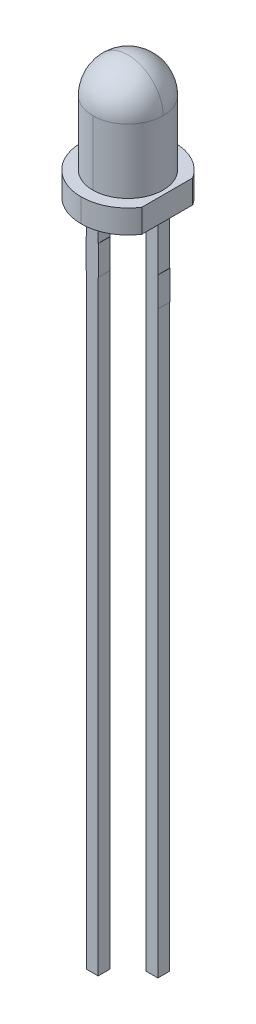
ISO-10303-21;
HEADER;
FILE_DESCRIPTION(('STEP AP214'),'2;1');
FILE_NAME('part.step','',(''),(''),'','','');
FILE_SCHEMA(('AUTOMOTIVE_DESIGN { 1 0 10303 214 1 1 1 1 }'));
ENDSEC;
DATA;
#1=APPLICATION_CONTEXT('core data for automotive mechanical design processes');
#2=APPLICATION_PROTOCOL_DEFINITION('international standard','automotive_design',2000,#1);
#3=PRODUCT_CONTEXT('',#1,'mechanical');
#4=PRODUCT('Part','Part','',(#3));
#5=PRODUCT_RELATED_PRODUCT_CATEGORY('part','',(#4));
#6=PRODUCT_DEFINITION_FORMATION('','',#4);
#7=PRODUCT_DEFINITION_CONTEXT('part definition',#1,'design');
#8=PRODUCT_DEFINITION('design','',#6,#7);
#9=PRODUCT_DEFINITION_SHAPE('','',#8);
#10=(LENGTH_UNIT() NAMED_UNIT(*) SI_UNIT(.MILLI.,.METRE.));
#11=(NAMED_UNIT(*) PLANE_ANGLE_UNIT() SI_UNIT($,.RADIAN.));
#12=(NAMED_UNIT(*) SI_UNIT($,.STERADIAN.) SOLID_ANGLE_UNIT());
#13=UNCERTAINTY_MEASURE_WITH_UNIT(LENGTH_MEASURE(1.E-05),#10,'distance_accuracy_value','');
#14=(GEOMETRIC_REPRESENTATION_CONTEXT(3) GLOBAL_UNCERTAINTY_ASSIGNED_CONTEXT((#13)) GLOBAL_UNIT_ASSIGNED_CONTEXT((#10,
#11,#12)) REPRESENTATION_CONTEXT('',''));
#15=CARTESIAN_POINT('',(0.,0.,0.));
#16=DIRECTION('',(0.,0.,1.));
#17=DIRECTION('',(1.,0.,0.));
#18=AXIS2_PLACEMENT_3D('',#15,#16,#17);
#19=CARTESIAN_POINT('',(1.68,2.53,1.18557375835093));
#20=DIRECTION('',(-1.,0.,0.));
#21=DIRECTION('',(0.,0.,1.));
#22=AXIS2_PLACEMENT_3D('',#19,#20,#21);
#23=PLANE('',#22);
#24=DIRECTION('',(0.,0.,1.));
#25=VECTOR('',#24,1.);
#26=CARTESIAN_POINT('',(1.68,1.,0.));
#27=LINE('',#26,#25);
#28=CARTESIAN_POINT('',(1.68,1.,-1.08517279730004));
#29=VERTEX_POINT('',#28);
#30=CARTESIAN_POINT('',(1.68,1.,1.08517279730004));
#31=VERTEX_POINT('',#30);
#32=EDGE_CURVE('P0_E50',#29,#31,#27,.T.);
#33=ORIENTED_EDGE('',*,*,#32,.T.);
#34=DIRECTION('',(0.,1.,0.));
#35=VECTOR('',#34,1.);
#36=CARTESIAN_POINT('',(1.68,1.,1.08517279730004));
#37=LINE('',#36,#35);
#38=CARTESIAN_POINT('',(1.68,0.,1.08517279730004));
#39=VERTEX_POINT('',#38);
#40=EDGE_CURVE('P0_E115',#39,#31,#37,.T.);
#41=ORIENTED_EDGE('',*,*,#40,.F.);
#42=DIRECTION('',(0.,0.,1.));
#43=VECTOR('',#42,1.);
#44=CARTESIAN_POINT('',(1.68,0.,0.));
#45=LINE('',#44,#43);
#46=CARTESIAN_POINT('',(1.68,0.,-1.08517279730004));
#47=VERTEX_POINT('',#46);
#48=EDGE_CURVE('P0_E24',#47,#39,#45,.T.);
#49=ORIENTED_EDGE('',*,*,#48,.F.);
#50=DIRECTION('',(0.,-1.,0.));
#51=VECTOR('',#50,1.);
#52=CARTESIAN_POINT('',(1.68,1.,-1.08517279730004));
#53=LINE('',#52,#51);
#54=EDGE_CURVE('P0_E132',#29,#47,#53,.T.);
#55=ORIENTED_EDGE('',*,*,#54,.F.);
#56=EDGE_LOOP('',(#33,#41,#49,#55));
#57=FACE_BOUND('',#56,.T.);
#58=ADVANCED_FACE('P0_F16',(#57),#23,.F.);
#59=CARTESIAN_POINT('',(0.,0.,0.));
#60=DIRECTION('',(0.,-1.,0.));
#61=DIRECTION('',(0.,0.,-1.));
#62=AXIS2_PLACEMENT_3D('',#59,#60,#61);
#63=CYLINDRICAL_SURFACE('',#62,1.5);
#64=DIRECTION('',(0.,-1.,0.));
#65=VECTOR('',#64,1.);
#66=CARTESIAN_POINT('',(0.,0.,1.5));
#67=LINE('',#66,#65);
#68=CARTESIAN_POINT('',(0.,3.75,1.5));
#69=VERTEX_POINT('',#68);
#70=CARTESIAN_POINT('',(0.,1.,1.5));
#71=VERTEX_POINT('',#70);
#72=EDGE_CURVE('P0_E159',#69,#71,#67,.T.);
#73=ORIENTED_EDGE('',*,*,#72,.F.);
#74=CARTESIAN_POINT('',(0.,3.75,0.));
#75=DIRECTION('',(0.,-1.,0.));
#76=DIRECTION('',(0.,0.,-1.));
#77=AXIS2_PLACEMENT_3D('',#74,#75,#76);
#78=CIRCLE('',#77,1.5);
#79=CARTESIAN_POINT('',(-1.5,3.75,0.));
#80=VERTEX_POINT('',#79);
#81=EDGE_CURVE('P0_E10',#69,#80,#78,.T.);
#82=ORIENTED_EDGE('',*,*,#81,.T.);
#83=CARTESIAN_POINT('',(0.,3.75,0.));
#84=DIRECTION('',(0.,-1.,0.));
#85=DIRECTION('',(0.,0.,-1.));
#86=AXIS2_PLACEMENT_3D('',#83,#84,#85);
#87=CIRCLE('',#86,1.5);
#88=CARTESIAN_POINT('',(0.,3.75,-1.5));
#89=VERTEX_POINT('',#88);
#90=EDGE_CURVE('P0_E125',#80,#89,#87,.T.);
#91=ORIENTED_EDGE('',*,*,#90,.T.);
#92=DIRECTION('',(0.,-1.,0.));
#93=VECTOR('',#92,1.);
#94=CARTESIAN_POINT('',(0.,0.,-1.5));
#95=LINE('',#94,#93);
#96=CARTESIAN_POINT('',(0.,1.,-1.5));
#97=VERTEX_POINT('',#96);
#98=EDGE_CURVE('P0_E168',#89,#97,#95,.T.);
#99=ORIENTED_EDGE('',*,*,#98,.T.);
#100=CARTESIAN_POINT('',(0.,1.,0.));
#101=DIRECTION('',(0.,-1.,0.));
#102=DIRECTION('',(0.,0.,-1.));
#103=AXIS2_PLACEMENT_3D('',#100,#101,#102);
#104=CIRCLE('',#103,1.5);
#105=EDGE_CURVE('P0_E143',#71,#97,#104,.T.);
#106=ORIENTED_EDGE('',*,*,#105,.F.);
#107=EDGE_LOOP('',(#73,#82,#91,#99,#106));
#108=FACE_BOUND('',#107,.T.);
#109=ADVANCED_FACE('P0_F195',(#108),#63,.T.);
#110=CARTESIAN_POINT('',(0.,3.75,0.));
#111=DIRECTION('',(0.,0.,-1.));
#112=DIRECTION('',(-1.,0.,0.));
#113=AXIS2_PLACEMENT_3D('',#110,#111,#112);
#114=SPHERICAL_SURFACE('',#113,1.5);
#115=CARTESIAN_POINT('',(0.,3.75,0.));
#116=DIRECTION('',(0.,0.,-1.));
#117=DIRECTION('',(-1.,0.,0.));
#118=AXIS2_PLACEMENT_3D('',#115,#116,#117);
#119=CIRCLE('',#118,1.5);
#120=CARTESIAN_POINT('',(0.,5.25,0.));
#121=VERTEX_POINT('',#120);
#122=CARTESIAN_POINT('',(1.5,3.75,0.));
#123=VERTEX_POINT('',#122);
#124=EDGE_CURVE('P0_E179',#121,#123,#119,.T.);
#125=ORIENTED_EDGE('',*,*,#124,.F.);
#126=CARTESIAN_POINT('',(0.,3.75,0.));
#127=DIRECTION('',(0.,0.,1.));
#128=DIRECTION('',(1.,0.,0.));
#129=AXIS2_PLACEMENT_3D('',#126,#127,#128);
#130=CIRCLE('',#129,1.5);
#131=EDGE_CURVE('P0_E175',#121,#80,#130,.T.);
#132=ORIENTED_EDGE('',*,*,#131,.T.);
#133=ORIENTED_EDGE('',*,*,#81,.F.);
#134=CARTESIAN_POINT('',(0.,3.75,0.));
#135=DIRECTION('',(0.,-1.,0.));
#136=DIRECTION('',(0.,0.,-1.));
#137=AXIS2_PLACEMENT_3D('',#134,#135,#136);
#138=CIRCLE('',#137,1.5);
#139=EDGE_CURVE('P0_E155',#123,#69,#138,.T.);
#140=ORIENTED_EDGE('',*,*,#139,.F.);
#141=EDGE_LOOP('',(#125,#132,#133,#140));
#142=FACE_BOUND('',#141,.T.);
#143=ADVANCED_FACE('P0_F214',(#142),#114,.T.);
#144=CARTESIAN_POINT('',(0.,0.,0.));
#145=DIRECTION('',(0.,1.,0.));
#146=DIRECTION('',(1.,0.,0.));
#147=AXIS2_PLACEMENT_3D('',#144,#145,#146);
#148=PLANE('',#147);
#149=CARTESIAN_POINT('',(0.,0.,0.));
#150=DIRECTION('',(0.,1.,0.));
#151=DIRECTION('',(0.,0.,1.));
#152=AXIS2_PLACEMENT_3D('',#149,#150,#151);
#153=CIRCLE('',#152,2.);
#154=CARTESIAN_POINT('',(0.,0.,-2.));
#155=VERTEX_POINT('',#154);
#156=EDGE_CURVE('P0_E139',#47,#155,#153,.T.);
#157=ORIENTED_EDGE('',*,*,#156,.F.);
#158=ORIENTED_EDGE('',*,*,#48,.T.);
#159=CARTESIAN_POINT('',(0.,0.,0.));
#160=DIRECTION('',(0.,1.,0.));
#161=DIRECTION('',(0.,0.,1.));
#162=AXIS2_PLACEMENT_3D('',#159,#160,#161);
#163=CIRCLE('',#162,2.);
#164=CARTESIAN_POINT('',(0.,0.,2.));
#165=VERTEX_POINT('',#164);
#166=EDGE_CURVE('P0_E110',#165,#39,#163,.T.);
#167=ORIENTED_EDGE('',*,*,#166,.F.);
#168=CARTESIAN_POINT('',(0.,0.,0.));
#169=DIRECTION('',(0.,1.,0.));
#170=DIRECTION('',(0.,0.,1.));
#171=AXIS2_PLACEMENT_3D('',#168,#169,#170);
#172=CIRCLE('',#171,2.);
#173=EDGE_CURVE('P0_E96',#155,#165,#172,.T.);
#174=ORIENTED_EDGE('',*,*,#173,.F.);
#175=EDGE_LOOP('',(#157,#158,#167,#174));
#176=FACE_BOUND('',#175,.T.);
#177=ADVANCED_FACE('P0_F111',(#176),#148,.F.);
#178=CARTESIAN_POINT('',(0.,1.,0.));
#179=DIRECTION('',(0.,1.,0.));
#180=DIRECTION('',(1.,0.,0.));
#181=AXIS2_PLACEMENT_3D('',#178,#179,#180);
#182=PLANE('',#181);
#183=CARTESIAN_POINT('',(0.,1.,0.));
#184=DIRECTION('',(0.,-1.,0.));
#185=DIRECTION('',(0.,0.,-1.));
#186=AXIS2_PLACEMENT_3D('',#183,#184,#185);
#187=CIRCLE('',#186,1.5);
#188=EDGE_CURVE('P0_E163',#97,#71,#187,.T.);
#189=ORIENTED_EDGE('',*,*,#188,.T.);
#190=ORIENTED_EDGE('',*,*,#105,.T.);
#191=EDGE_LOOP('',(#189,#190));
#192=FACE_BOUND('',#191,.T.);
#193=ORIENTED_EDGE('',*,*,#32,.F.);
#194=CARTESIAN_POINT('',(0.,1.,0.));
#195=DIRECTION('',(0.,1.,0.));
#196=DIRECTION('',(0.,0.,1.));
#197=AXIS2_PLACEMENT_3D('',#194,#195,#196);
#198=CIRCLE('',#197,2.);
#199=CARTESIAN_POINT('',(0.,1.,-2.));
#200=VERTEX_POINT('',#199);
#201=EDGE_CURVE('P0_E107',#29,#200,#198,.T.);
#202=ORIENTED_EDGE('',*,*,#201,.T.);
#203=CARTESIAN_POINT('',(0.,1.,0.));
#204=DIRECTION('',(0.,1.,0.));
#205=DIRECTION('',(0.,0.,1.));
#206=AXIS2_PLACEMENT_3D('',#203,#204,#205);
#207=CIRCLE('',#206,2.);
#208=CARTESIAN_POINT('',(0.,1.,2.));
#209=VERTEX_POINT('',#208);
#210=EDGE_CURVE('P0_E134',#200,#209,#207,.T.);
#211=ORIENTED_EDGE('',*,*,#210,.T.);
#212=CARTESIAN_POINT('',(0.,1.,0.));
#213=DIRECTION('',(0.,1.,0.));
#214=DIRECTION('',(0.,0.,1.));
#215=AXIS2_PLACEMENT_3D('',#212,#213,#214);
#216=CIRCLE('',#215,2.);
#217=EDGE_CURVE('P0_E118',#209,#31,#216,.T.);
#218=ORIENTED_EDGE('',*,*,#217,.T.);
#219=EDGE_LOOP('',(#193,#202,#211,#218));
#220=FACE_BOUND('',#219,.T.);
#221=ADVANCED_FACE('P0_F203',(#192,#220),#182,.T.);
#222=CARTESIAN_POINT('',(0.,1.,0.));
#223=DIRECTION('',(0.,-1.,0.));
#224=DIRECTION('',(0.,0.,-1.));
#225=AXIS2_PLACEMENT_3D('',#222,#223,#224);
#226=CYLINDRICAL_SURFACE('',#225,2.);
#227=DIRECTION('',(0.,-1.,0.));
#228=VECTOR('',#227,1.);
#229=CARTESIAN_POINT('',(0.,1.,-2.));
#230=LINE('',#229,#228);
#231=EDGE_CURVE('P0_E104',#200,#155,#230,.T.);
#232=ORIENTED_EDGE('',*,*,#231,.F.);
#233=ORIENTED_EDGE('',*,*,#201,.F.);
#234=ORIENTED_EDGE('',*,*,#54,.T.);
#235=ORIENTED_EDGE('',*,*,#156,.T.);
#236=EDGE_LOOP('',(#232,#233,#234,#235));
#237=FACE_BOUND('',#236,.T.);
#238=ADVANCED_FACE('P0_F205',(#237),#226,.T.);
#239=CARTESIAN_POINT('',(0.,1.,0.));
#240=DIRECTION('',(0.,-1.,0.));
#241=DIRECTION('',(0.,0.,-1.));
#242=AXIS2_PLACEMENT_3D('',#239,#240,#241);
#243=CYLINDRICAL_SURFACE('',#242,2.);
#244=DIRECTION('',(0.,-1.,0.));
#245=VECTOR('',#244,1.);
#246=CARTESIAN_POINT('',(0.,1.,2.));
#247=LINE('',#246,#245);
#248=EDGE_CURVE('P0_E101',#209,#165,#247,.T.);
#249=ORIENTED_EDGE('',*,*,#248,.F.);
#250=ORIENTED_EDGE('',*,*,#210,.F.);
#251=ORIENTED_EDGE('',*,*,#231,.T.);
#252=ORIENTED_EDGE('',*,*,#173,.T.);
#253=EDGE_LOOP('',(#249,#250,#251,#252));
#254=FACE_BOUND('',#253,.T.);
#255=ADVANCED_FACE('P0_F98',(#254),#243,.T.);
#256=CARTESIAN_POINT('',(0.,1.,0.));
#257=DIRECTION('',(0.,-1.,0.));
#258=DIRECTION('',(0.,0.,-1.));
#259=AXIS2_PLACEMENT_3D('',#256,#257,#258);
#260=CYLINDRICAL_SURFACE('',#259,2.);
#261=ORIENTED_EDGE('',*,*,#217,.F.);
#262=ORIENTED_EDGE('',*,*,#248,.T.);
#263=ORIENTED_EDGE('',*,*,#166,.T.);
#264=ORIENTED_EDGE('',*,*,#40,.T.);
#265=EDGE_LOOP('',(#261,#262,#263,#264));
#266=FACE_BOUND('',#265,.T.);
#267=ADVANCED_FACE('P0_F117',(#266),#260,.T.);
#268=CARTESIAN_POINT('',(0.,3.75,0.));
#269=DIRECTION('',(0.,0.,-1.));
#270=DIRECTION('',(-1.,0.,0.));
#271=AXIS2_PLACEMENT_3D('',#268,#269,#270);
#272=SPHERICAL_SURFACE('',#271,1.5);
#273=ORIENTED_EDGE('',*,*,#131,.F.);
#274=ORIENTED_EDGE('',*,*,#124,.T.);
#275=CARTESIAN_POINT('',(0.,3.75,0.));
#276=DIRECTION('',(0.,-1.,0.));
#277=DIRECTION('',(0.,0.,-1.));
#278=AXIS2_PLACEMENT_3D('',#275,#276,#277);
#279=CIRCLE('',#278,1.5);
#280=EDGE_CURVE('P0_E171',#89,#123,#279,.T.);
#281=ORIENTED_EDGE('',*,*,#280,.F.);
#282=ORIENTED_EDGE('',*,*,#90,.F.);
#283=EDGE_LOOP('',(#273,#274,#281,#282));
#284=FACE_BOUND('',#283,.T.);
#285=ADVANCED_FACE('P0_F199',(#284),#272,.T.);
#286=CARTESIAN_POINT('',(0.,0.,0.));
#287=DIRECTION('',(0.,-1.,0.));
#288=DIRECTION('',(0.,0.,-1.));
#289=AXIS2_PLACEMENT_3D('',#286,#287,#288);
#290=CYLINDRICAL_SURFACE('',#289,1.5);
#291=ORIENTED_EDGE('',*,*,#139,.T.);
#292=ORIENTED_EDGE('',*,*,#72,.T.);
#293=ORIENTED_EDGE('',*,*,#188,.F.);
#294=ORIENTED_EDGE('',*,*,#98,.F.);
#295=ORIENTED_EDGE('',*,*,#280,.T.);
#296=EDGE_LOOP('',(#291,#292,#293,#294,#295));
#297=FACE_BOUND('',#296,.T.);
#298=ADVANCED_FACE('P0_F202',(#297),#290,.T.);
#299=CLOSED_SHELL('',(#58,#109,#143,#177,#221,#238,#255,#267,#285,#298));
#300=MANIFOLD_SOLID_BREP('P0_B1',#299);
#301=CARTESIAN_POINT('',(-1.015,-3.3590830423855,-1.60384641730942));
#302=DIRECTION('',(1.,0.,0.));
#303=DIRECTION('',(0.,1.,0.));
#304=AXIS2_PLACEMENT_3D('',#301,#302,#303);
#305=PLANE('',#304);
#306=DIRECTION('',(0.,-1.,0.));
#307=VECTOR('',#306,1.);
#308=CARTESIAN_POINT('',(-1.015,-3.3590830423855,-0.250000008));
#309=LINE('',#308,#307);
#310=CARTESIAN_POINT('',(-1.015,-2.1090830023855,-0.250000008));
#311=VERTEX_POINT('',#310);
#312=CARTESIAN_POINT('',(-1.015,-3.3590830423855,-0.250000008));
#313=VERTEX_POINT('',#312);
#314=EDGE_CURVE('P1_E189',#311,#313,#309,.T.);
#315=ORIENTED_EDGE('',*,*,#314,.F.);
#316=DIRECTION('',(0.,0.,1.));
#317=VECTOR('',#316,1.);
#318=CARTESIAN_POINT('',(-1.015,-2.1090830023855,-1.60384641730942));
#319=LINE('',#318,#317);
#320=CARTESIAN_POINT('',(-1.015,-2.1090830023855,0.250000008));
#321=VERTEX_POINT('',#320);
#322=EDGE_CURVE('P1_E11',#311,#321,#319,.T.);
#323=ORIENTED_EDGE('',*,*,#322,.T.);
#324=DIRECTION('',(0.,1.,0.));
#325=VECTOR('',#324,1.);
#326=CARTESIAN_POINT('',(-1.015,-3.3590830423855,0.250000008));
#327=LINE('',#326,#325);
#328=CARTESIAN_POINT('',(-1.015,-3.3590830423855,0.250000008));
#329=VERTEX_POINT('',#328);
#330=EDGE_CURVE('P1_E195',#329,#321,#327,.T.);
#331=ORIENTED_EDGE('',*,*,#330,.F.);
#332=DIRECTION('',(0.,0.,1.));
#333=VECTOR('',#332,1.);
#334=CARTESIAN_POINT('',(-1.015,-3.3590830423855,-1.60384641730942));
#335=LINE('',#334,#333);
#336=EDGE_CURVE('P1_E20',#313,#329,#335,.T.);
#337=ORIENTED_EDGE('',*,*,#336,.F.);
#338=EDGE_LOOP('',(#315,#323,#331,#337));
#339=FACE_BOUND('',#338,.T.);
#340=ADVANCED_FACE('P1_F17',(#339),#305,.T.);
#341=CARTESIAN_POINT('',(-1.535,-2.1090830023855,-1.60384641730942));
#342=DIRECTION('',(0.,1.,0.));
#343=DIRECTION('',(1.,0.,0.));
#344=AXIS2_PLACEMENT_3D('',#341,#342,#343);
#345=PLANE('',#344);
#346=DIRECTION('',(0.,0.,-1.));
#347=VECTOR('',#346,1.);
#348=CARTESIAN_POINT('',(-1.025,-2.10908300238549,0.));
#349=LINE('',#348,#347);
#350=CARTESIAN_POINT('',(-1.025,-2.10908300238549,0.250000008));
#351=VERTEX_POINT('',#350);
#352=CARTESIAN_POINT('',(-1.025,-2.1090830023855,-0.250000008));
#353=VERTEX_POINT('',#352);
#354=EDGE_CURVE('P1_E238',#351,#353,#349,.T.);
#355=ORIENTED_EDGE('',*,*,#354,.F.);
#356=DIRECTION('',(-1.,0.,0.));
#357=VECTOR('',#356,1.);
#358=CARTESIAN_POINT('',(-1.535,-2.1090830023855,0.250000008));
#359=LINE('',#358,#357);
#360=EDGE_CURVE('P1_E193',#321,#351,#359,.T.);
#361=ORIENTED_EDGE('',*,*,#360,.F.);
#362=ORIENTED_EDGE('',*,*,#322,.F.);
#363=DIRECTION('',(1.,0.,0.));
#364=VECTOR('',#363,1.);
#365=CARTESIAN_POINT('',(-1.535,-2.1090830023855,-0.250000008));
#366=LINE('',#365,#364);
#367=EDGE_CURVE('P1_E192',#353,#311,#366,.T.);
#368=ORIENTED_EDGE('',*,*,#367,.F.);
#369=EDGE_LOOP('',(#355,#361,#362,#368));
#370=FACE_BOUND('',#369,.T.);
#371=ADVANCED_FACE('P1_F298',(#370),#345,.T.);
#372=CARTESIAN_POINT('',(-1.535,-3.3590830423855,-1.60384641730942));
#373=DIRECTION('',(0.,-1.,0.));
#374=DIRECTION('',(0.,0.,-1.));
#375=AXIS2_PLACEMENT_3D('',#372,#373,#374);
#376=PLANE('',#375);
#377=DIRECTION('',(0.,0.,1.));
#378=VECTOR('',#377,1.);
#379=CARTESIAN_POINT('',(-1.025,-3.3590830423855,0.));
#380=LINE('',#379,#378);
#381=CARTESIAN_POINT('',(-1.025,-3.3590830423855,-0.250000008));
#382=VERTEX_POINT('',#381);
#383=CARTESIAN_POINT('',(-1.025,-3.3590830423855,0.250000008));
#384=VERTEX_POINT('',#383);
#385=EDGE_CURVE('P1_E167',#382,#384,#380,.T.);
#386=ORIENTED_EDGE('',*,*,#385,.F.);
#387=DIRECTION('',(-1.,0.,0.));
#388=VECTOR('',#387,1.);
#389=CARTESIAN_POINT('',(-1.535,-3.3590830423855,-0.250000008));
#390=LINE('',#389,#388);
#391=EDGE_CURVE('P1_E150',#313,#382,#390,.T.);
#392=ORIENTED_EDGE('',*,*,#391,.F.);
#393=ORIENTED_EDGE('',*,*,#336,.T.);
#394=DIRECTION('',(1.,0.,0.));
#395=VECTOR('',#394,1.);
#396=CARTESIAN_POINT('',(-1.535,-3.3590830423855,0.250000008));
#397=LINE('',#396,#395);
#398=EDGE_CURVE('P1_E256',#384,#329,#397,.T.);
#399=ORIENTED_EDGE('',*,*,#398,.F.);
#400=EDGE_LOOP('',(#386,#392,#393,#399));
#401=FACE_BOUND('',#400,.T.);
#402=ADVANCED_FACE('P1_F312',(#401),#376,.T.);
#403=CARTESIAN_POINT('',(-1.535,-3.3590830423855,-1.60384641730942));
#404=DIRECTION('',(0.,-1.,0.));
#405=DIRECTION('',(0.,0.,-1.));
#406=AXIS2_PLACEMENT_3D('',#403,#404,#405);
#407=PLANE('',#406);
#408=DIRECTION('',(-1.,0.,0.));
#409=VECTOR('',#408,1.);
#410=CARTESIAN_POINT('',(-1.535,-3.3590830423855,-0.250000008));
#411=LINE('',#410,#409);
#412=CARTESIAN_POINT('',(-1.525,-3.3590830423855,-0.250000008));
#413=VERTEX_POINT('',#412);
#414=CARTESIAN_POINT('',(-1.535,-3.3590830423855,-0.250000008));
#415=VERTEX_POINT('',#414);
#416=EDGE_CURVE('P1_E149',#413,#415,#411,.T.);
#417=ORIENTED_EDGE('',*,*,#416,.F.);
#418=DIRECTION('',(0.,0.,1.));
#419=VECTOR('',#418,1.);
#420=CARTESIAN_POINT('',(-1.525,-3.3590830423855,0.));
#421=LINE('',#420,#419);
#422=CARTESIAN_POINT('',(-1.525,-3.3590830423855,0.250000008));
#423=VERTEX_POINT('',#422);
#424=EDGE_CURVE('P1_E160',#413,#423,#421,.T.);
#425=ORIENTED_EDGE('',*,*,#424,.T.);
#426=DIRECTION('',(1.,0.,0.));
#427=VECTOR('',#426,1.);
#428=CARTESIAN_POINT('',(-1.535,-3.3590830423855,0.250000008));
#429=LINE('',#428,#427);
#430=CARTESIAN_POINT('',(-1.535,-3.3590830423855,0.250000008));
#431=VERTEX_POINT('',#430);
#432=EDGE_CURVE('P1_E197',#431,#423,#429,.T.);
#433=ORIENTED_EDGE('',*,*,#432,.F.);
#434=DIRECTION('',(0.,0.,1.));
#435=VECTOR('',#434,1.);
#436=CARTESIAN_POINT('',(-1.535,-3.3590830423855,-1.60384641730942));
#437=LINE('',#436,#435);
#438=EDGE_CURVE('P1_E268',#415,#431,#437,.T.);
#439=ORIENTED_EDGE('',*,*,#438,.F.);
#440=EDGE_LOOP('',(#417,#425,#433,#439));
#441=FACE_BOUND('',#440,.T.);
#442=ADVANCED_FACE('P1_F316',(#441),#407,.T.);
#443=CARTESIAN_POINT('',(-1.535,-2.1090830023855,-1.60384641730942));
#444=DIRECTION('',(0.,1.,0.));
#445=DIRECTION('',(1.,0.,0.));
#446=AXIS2_PLACEMENT_3D('',#443,#444,#445);
#447=PLANE('',#446);
#448=DIRECTION('',(-1.,0.,0.));
#449=VECTOR('',#448,1.);
#450=CARTESIAN_POINT('',(-1.535,-2.1090830023855,0.250000008));
#451=LINE('',#450,#449);
#452=CARTESIAN_POINT('',(-1.525,-2.1090830023855,0.250000008));
#453=VERTEX_POINT('',#452);
#454=CARTESIAN_POINT('',(-1.535,-2.1090830023855,0.250000008));
#455=VERTEX_POINT('',#454);
#456=EDGE_CURVE('P1_E249',#453,#455,#451,.T.);
#457=ORIENTED_EDGE('',*,*,#456,.F.);
#458=DIRECTION('',(0.,0.,-1.));
#459=VECTOR('',#458,1.);
#460=CARTESIAN_POINT('',(-1.525,-2.10908300238549,0.));
#461=LINE('',#460,#459);
#462=CARTESIAN_POINT('',(-1.525,-2.1090830023855,-0.250000008));
#463=VERTEX_POINT('',#462);
#464=EDGE_CURVE('P1_E184',#453,#463,#461,.T.);
#465=ORIENTED_EDGE('',*,*,#464,.T.);
#466=DIRECTION('',(1.,0.,0.));
#467=VECTOR('',#466,1.);
#468=CARTESIAN_POINT('',(-1.535,-2.1090830023855,-0.250000008));
#469=LINE('',#468,#467);
#470=CARTESIAN_POINT('',(-1.535,-2.1090830023855,-0.250000008));
#471=VERTEX_POINT('',#470);
#472=EDGE_CURVE('P1_E176',#471,#463,#469,.T.);
#473=ORIENTED_EDGE('',*,*,#472,.F.);
#474=DIRECTION('',(0.,0.,1.));
#475=VECTOR('',#474,1.);
#476=CARTESIAN_POINT('',(-1.535,-2.1090830023855,-1.60384641730942));
#477=LINE('',#476,#475);
#478=EDGE_CURVE('P1_E271',#471,#455,#477,.T.);
#479=ORIENTED_EDGE('',*,*,#478,.T.);
#480=EDGE_LOOP('',(#457,#465,#473,#479));
#481=FACE_BOUND('',#480,.T.);
#482=ADVANCED_FACE('P1_F307',(#481),#447,.T.);
#483=CARTESIAN_POINT('',(-1.535,-3.3590830423855,-1.60384641730942));
#484=DIRECTION('',(-1.,0.,0.));
#485=DIRECTION('',(0.,0.,1.));
#486=AXIS2_PLACEMENT_3D('',#483,#484,#485);
#487=PLANE('',#486);
#488=DIRECTION('',(0.,1.,0.));
#489=VECTOR('',#488,1.);
#490=CARTESIAN_POINT('',(-1.535,-3.3590830423855,-0.250000008));
#491=LINE('',#490,#489);
#492=EDGE_CURVE('P1_E180',#415,#471,#491,.T.);
#493=ORIENTED_EDGE('',*,*,#492,.F.);
#494=ORIENTED_EDGE('',*,*,#438,.T.);
#495=DIRECTION('',(0.,-1.,0.));
#496=VECTOR('',#495,1.);
#497=CARTESIAN_POINT('',(-1.535,-3.3590830423855,0.250000008));
#498=LINE('',#497,#496);
#499=EDGE_CURVE('P1_E201',#455,#431,#498,.T.);
#500=ORIENTED_EDGE('',*,*,#499,.F.);
#501=ORIENTED_EDGE('',*,*,#478,.F.);
#502=EDGE_LOOP('',(#493,#494,#500,#501));
#503=FACE_BOUND('',#502,.T.);
#504=ADVANCED_FACE('P1_F302',(#503),#487,.T.);
#505=CARTESIAN_POINT('',(0.,0.,0.));
#506=DIRECTION('',(0.,-1.,0.));
#507=DIRECTION('',(0.,0.,-1.));
#508=AXIS2_PLACEMENT_3D('',#505,#506,#507);
#509=PLANE('',#508);
#510=DIRECTION('',(-1.,0.,0.));
#511=VECTOR('',#510,1.);
#512=CARTESIAN_POINT('',(0.,0.,-0.250000008));
#513=LINE('',#512,#511);
#514=CARTESIAN_POINT('',(-1.025,0.,-0.250000008));
#515=VERTEX_POINT('',#514);
#516=CARTESIAN_POINT('',(-1.525,0.,-0.250000008));
#517=VERTEX_POINT('',#516);
#518=EDGE_CURVE('P1_E230',#515,#517,#513,.T.);
#519=ORIENTED_EDGE('',*,*,#518,.T.);
#520=DIRECTION('',(0.,0.,1.));
#521=VECTOR('',#520,1.);
#522=CARTESIAN_POINT('',(-1.525,0.,0.));
#523=LINE('',#522,#521);
#524=CARTESIAN_POINT('',(-1.525,0.,0.250000008));
#525=VERTEX_POINT('',#524);
#526=EDGE_CURVE('P1_E187',#517,#525,#523,.T.);
#527=ORIENTED_EDGE('',*,*,#526,.T.);
#528=DIRECTION('',(-1.,0.,0.));
#529=VECTOR('',#528,1.);
#530=CARTESIAN_POINT('',(0.,0.,0.250000008));
#531=LINE('',#530,#529);
#532=CARTESIAN_POINT('',(-1.025,0.,0.250000008));
#533=VERTEX_POINT('',#532);
#534=EDGE_CURVE('P1_E188',#533,#525,#531,.T.);
#535=ORIENTED_EDGE('',*,*,#534,.F.);
#536=DIRECTION('',(0.,0.,1.));
#537=VECTOR('',#536,1.);
#538=CARTESIAN_POINT('',(-1.025,0.,0.));
#539=LINE('',#538,#537);
#540=EDGE_CURVE('P1_E241',#515,#533,#539,.T.);
#541=ORIENTED_EDGE('',*,*,#540,.F.);
#542=EDGE_LOOP('',(#519,#527,#535,#541));
#543=FACE_BOUND('',#542,.T.);
#544=ADVANCED_FACE('P1_F306',(#543),#509,.F.);
#545=CARTESIAN_POINT('',(0.,-29.2,0.));
#546=DIRECTION('',(0.,-1.,0.));
#547=DIRECTION('',(0.,0.,-1.));
#548=AXIS2_PLACEMENT_3D('',#545,#546,#547);
#549=PLANE('',#548);
#550=DIRECTION('',(-1.,0.,0.));
#551=VECTOR('',#550,1.);
#552=CARTESIAN_POINT('',(0.,-29.2,-0.250000008));
#553=LINE('',#552,#551);
#554=CARTESIAN_POINT('',(-1.025,-29.2,-0.250000008));
#555=VERTEX_POINT('',#554);
#556=CARTESIAN_POINT('',(-1.525,-29.2,-0.250000008));
#557=VERTEX_POINT('',#556);
#558=EDGE_CURVE('P1_E137',#555,#557,#553,.T.);
#559=ORIENTED_EDGE('',*,*,#558,.F.);
#560=DIRECTION('',(0.,0.,1.));
#561=VECTOR('',#560,1.);
#562=CARTESIAN_POINT('',(-1.025,-29.2,0.));
#563=LINE('',#562,#561);
#564=CARTESIAN_POINT('',(-1.025,-29.2,0.250000008));
#565=VERTEX_POINT('',#564);
#566=EDGE_CURVE('P1_E140',#555,#565,#563,.T.);
#567=ORIENTED_EDGE('',*,*,#566,.T.);
#568=DIRECTION('',(-1.,0.,0.));
#569=VECTOR('',#568,1.);
#570=CARTESIAN_POINT('',(0.,-29.2,0.250000008));
#571=LINE('',#570,#569);
#572=CARTESIAN_POINT('',(-1.525,-29.2,0.250000008));
#573=VERTEX_POINT('',#572);
#574=EDGE_CURVE('P1_E200',#565,#573,#571,.T.);
#575=ORIENTED_EDGE('',*,*,#574,.T.);
#576=DIRECTION('',(0.,0.,1.));
#577=VECTOR('',#576,1.);
#578=CARTESIAN_POINT('',(-1.525,-29.2,0.));
#579=LINE('',#578,#577);
#580=EDGE_CURVE('P1_E143',#557,#573,#579,.T.);
#581=ORIENTED_EDGE('',*,*,#580,.F.);
#582=EDGE_LOOP('',(#559,#567,#575,#581));
#583=FACE_BOUND('',#582,.T.);
#584=ADVANCED_FACE('P1_F139',(#583),#549,.T.);
#585=CARTESIAN_POINT('',(-1.525,-29.2,0.));
#586=DIRECTION('',(-1.,0.,0.));
#587=DIRECTION('',(0.,0.,1.));
#588=AXIS2_PLACEMENT_3D('',#585,#586,#587);
#589=PLANE('',#588);
#590=ORIENTED_EDGE('',*,*,#464,.F.);
#591=DIRECTION('',(0.,1.,0.));
#592=VECTOR('',#591,1.);
#593=CARTESIAN_POINT('',(-1.525,-29.2,0.250000008));
#594=LINE('',#593,#592);
#595=EDGE_CURVE('P1_E245',#453,#525,#594,.T.);
#596=ORIENTED_EDGE('',*,*,#595,.T.);
#597=ORIENTED_EDGE('',*,*,#526,.F.);
#598=DIRECTION('',(0.,1.,0.));
#599=VECTOR('',#598,1.);
#600=CARTESIAN_POINT('',(-1.525,-29.2,-0.250000008));
#601=LINE('',#600,#599);
#602=EDGE_CURVE('P1_E179',#463,#517,#601,.T.);
#603=ORIENTED_EDGE('',*,*,#602,.F.);
#604=EDGE_LOOP('',(#590,#596,#597,#603));
#605=FACE_BOUND('',#604,.T.);
#606=ADVANCED_FACE('P1_F326',(#605),#589,.T.);
#607=CARTESIAN_POINT('',(0.,-29.2,0.250000008));
#608=DIRECTION('',(0.,0.,-1.));
#609=DIRECTION('',(0.,-1.,0.));
#610=AXIS2_PLACEMENT_3D('',#607,#608,#609);
#611=PLANE('',#610);
#612=ORIENTED_EDGE('',*,*,#595,.F.);
#613=ORIENTED_EDGE('',*,*,#456,.T.);
#614=ORIENTED_EDGE('',*,*,#499,.T.);
#615=ORIENTED_EDGE('',*,*,#432,.T.);
#616=DIRECTION('',(0.,1.,0.));
#617=VECTOR('',#616,1.);
#618=CARTESIAN_POINT('',(-1.525,-29.2,0.250000008));
#619=LINE('',#618,#617);
#620=EDGE_CURVE('P1_E210',#573,#423,#619,.T.);
#621=ORIENTED_EDGE('',*,*,#620,.F.);
#622=ORIENTED_EDGE('',*,*,#574,.F.);
#623=DIRECTION('',(0.,1.,0.));
#624=VECTOR('',#623,1.);
#625=CARTESIAN_POINT('',(-1.025,-29.2,0.250000008));
#626=LINE('',#625,#624);
#627=EDGE_CURVE('P1_E158',#565,#384,#626,.T.);
#628=ORIENTED_EDGE('',*,*,#627,.T.);
#629=ORIENTED_EDGE('',*,*,#398,.T.);
#630=ORIENTED_EDGE('',*,*,#330,.T.);
#631=ORIENTED_EDGE('',*,*,#360,.T.);
#632=DIRECTION('',(0.,1.,0.));
#633=VECTOR('',#632,1.);
#634=CARTESIAN_POINT('',(-1.025,-29.2,0.250000008));
#635=LINE('',#634,#633);
#636=EDGE_CURVE('P1_E234',#351,#533,#635,.T.);
#637=ORIENTED_EDGE('',*,*,#636,.T.);
#638=ORIENTED_EDGE('',*,*,#534,.T.);
#639=EDGE_LOOP('',(#612,#613,#614,#615,#621,#622,#628,#629,#630,#631,#637,#638));
#640=FACE_BOUND('',#639,.T.);
#641=ADVANCED_FACE('P1_F321',(#640),#611,.F.);
#642=CARTESIAN_POINT('',(-1.025,-29.2,0.));
#643=DIRECTION('',(-1.,0.,0.));
#644=DIRECTION('',(0.,0.,1.));
#645=AXIS2_PLACEMENT_3D('',#642,#643,#644);
#646=PLANE('',#645);
#647=ORIENTED_EDGE('',*,*,#636,.F.);
#648=ORIENTED_EDGE('',*,*,#354,.T.);
#649=DIRECTION('',(0.,1.,0.));
#650=VECTOR('',#649,1.);
#651=CARTESIAN_POINT('',(-1.025,-29.2,-0.250000008));
#652=LINE('',#651,#650);
#653=EDGE_CURVE('P1_E206',#353,#515,#652,.T.);
#654=ORIENTED_EDGE('',*,*,#653,.T.);
#655=ORIENTED_EDGE('',*,*,#540,.T.);
#656=EDGE_LOOP('',(#647,#648,#654,#655));
#657=FACE_BOUND('',#656,.T.);
#658=ADVANCED_FACE('P1_F325',(#657),#646,.F.);
#659=CARTESIAN_POINT('',(0.,-29.2,-0.250000008));
#660=DIRECTION('',(0.,0.,-1.));
#661=DIRECTION('',(0.,-1.,0.));
#662=AXIS2_PLACEMENT_3D('',#659,#660,#661);
#663=PLANE('',#662);
#664=ORIENTED_EDGE('',*,*,#653,.F.);
#665=ORIENTED_EDGE('',*,*,#367,.T.);
#666=ORIENTED_EDGE('',*,*,#314,.T.);
#667=ORIENTED_EDGE('',*,*,#391,.T.);
#668=DIRECTION('',(0.,1.,0.));
#669=VECTOR('',#668,1.);
#670=CARTESIAN_POINT('',(-1.025,-29.2,-0.250000008));
#671=LINE('',#670,#669);
#672=EDGE_CURVE('P1_E156',#555,#382,#671,.T.);
#673=ORIENTED_EDGE('',*,*,#672,.F.);
#674=ORIENTED_EDGE('',*,*,#558,.T.);
#675=DIRECTION('',(0.,1.,0.));
#676=VECTOR('',#675,1.);
#677=CARTESIAN_POINT('',(-1.525,-29.2,-0.250000008));
#678=LINE('',#677,#676);
#679=EDGE_CURVE('P1_E205',#557,#413,#678,.T.);
#680=ORIENTED_EDGE('',*,*,#679,.T.);
#681=ORIENTED_EDGE('',*,*,#416,.T.);
#682=ORIENTED_EDGE('',*,*,#492,.T.);
#683=ORIENTED_EDGE('',*,*,#472,.T.);
#684=ORIENTED_EDGE('',*,*,#602,.T.);
#685=ORIENTED_EDGE('',*,*,#518,.F.);
#686=EDGE_LOOP('',(#664,#665,#666,#667,#673,#674,#680,#681,#682,#683,#684,#685));
#687=FACE_BOUND('',#686,.T.);
#688=ADVANCED_FACE('P1_F163',(#687),#663,.T.);
#689=CARTESIAN_POINT('',(-1.525,-29.2,0.));
#690=DIRECTION('',(-1.,0.,0.));
#691=DIRECTION('',(0.,0.,1.));
#692=AXIS2_PLACEMENT_3D('',#689,#690,#691);
#693=PLANE('',#692);
#694=ORIENTED_EDGE('',*,*,#424,.F.);
#695=ORIENTED_EDGE('',*,*,#679,.F.);
#696=ORIENTED_EDGE('',*,*,#580,.T.);
#697=ORIENTED_EDGE('',*,*,#620,.T.);
#698=EDGE_LOOP('',(#694,#695,#696,#697));
#699=FACE_BOUND('',#698,.T.);
#700=ADVANCED_FACE('P1_F365',(#699),#693,.T.);
#701=CARTESIAN_POINT('',(-1.025,-29.2,0.));
#702=DIRECTION('',(-1.,0.,0.));
#703=DIRECTION('',(0.,0.,1.));
#704=AXIS2_PLACEMENT_3D('',#701,#702,#703);
#705=PLANE('',#704);
#706=ORIENTED_EDGE('',*,*,#672,.T.);
#707=ORIENTED_EDGE('',*,*,#385,.T.);
#708=ORIENTED_EDGE('',*,*,#627,.F.);
#709=ORIENTED_EDGE('',*,*,#566,.F.);
#710=EDGE_LOOP('',(#706,#707,#708,#709));
#711=FACE_BOUND('',#710,.T.);
#712=ADVANCED_FACE('P1_F154',(#711),#705,.F.);
#713=CLOSED_SHELL('',(#340,#371,#402,#442,#482,#504,#544,#584,#606,#641,#658,#688,#700,#712));
#714=MANIFOLD_SOLID_BREP('P1_B1',#713);
#715=CARTESIAN_POINT('',(1.534999988,-3.24710583247331,-1.60384641730942));
#716=DIRECTION('',(1.,0.,0.));
#717=DIRECTION('',(0.,1.,0.));
#718=AXIS2_PLACEMENT_3D('',#715,#716,#717);
#719=PLANE('',#718);
#720=DIRECTION('',(0.,-1.,0.));
#721=VECTOR('',#720,1.);
#722=CARTESIAN_POINT('',(1.534999988,-3.24710583247331,-0.250000008));
#723=LINE('',#722,#721);
#724=CARTESIAN_POINT('',(1.534999988,-1.99710583247332,-0.250000008));
#725=VERTEX_POINT('',#724);
#726=CARTESIAN_POINT('',(1.534999988,-3.24710583247331,-0.250000008));
#727=VERTEX_POINT('',#726);
#728=EDGE_CURVE('P2_E270',#725,#727,#723,.T.);
#729=ORIENTED_EDGE('',*,*,#728,.F.);
#730=DIRECTION('',(0.,0.,1.));
#731=VECTOR('',#730,1.);
#732=CARTESIAN_POINT('',(1.534999988,-1.99710583247332,-1.60384641730942));
#733=LINE('',#732,#731);
#734=CARTESIAN_POINT('',(1.534999988,-1.99710583247332,0.250000008));
#735=VERTEX_POINT('',#734);
#736=EDGE_CURVE('P2_E10',#725,#735,#733,.T.);
#737=ORIENTED_EDGE('',*,*,#736,.T.);
#738=DIRECTION('',(0.,1.,0.));
#739=VECTOR('',#738,1.);
#740=CARTESIAN_POINT('',(1.534999988,-3.24710583247331,0.250000008));
#741=LINE('',#740,#739);
#742=CARTESIAN_POINT('',(1.534999988,-3.24710583247331,0.250000008));
#743=VERTEX_POINT('',#742);
#744=EDGE_CURVE('P2_E125',#743,#735,#741,.T.);
#745=ORIENTED_EDGE('',*,*,#744,.F.);
#746=DIRECTION('',(0.,0.,1.));
#747=VECTOR('',#746,1.);
#748=CARTESIAN_POINT('',(1.534999988,-3.24710583247331,-1.60384641730942));
#749=LINE('',#748,#747);
#750=EDGE_CURVE('P2_E24',#727,#743,#749,.T.);
#751=ORIENTED_EDGE('',*,*,#750,.F.);
#752=EDGE_LOOP('',(#729,#737,#745,#751));
#753=FACE_BOUND('',#752,.T.);
#754=ADVANCED_FACE('P2_F16',(#753),#719,.T.);
#755=CARTESIAN_POINT('',(1.015000012,-1.99710583247332,-1.60384641730942));
#756=DIRECTION('',(0.,1.,0.));
#757=DIRECTION('',(1.,0.,0.));
#758=AXIS2_PLACEMENT_3D('',#755,#756,#757);
#759=PLANE('',#758);
#760=DIRECTION('',(0.,0.,-1.));
#761=VECTOR('',#760,1.);
#762=CARTESIAN_POINT('',(1.525,-1.99710583247332,0.));
#763=LINE('',#762,#761);
#764=CARTESIAN_POINT('',(1.525,-1.99710583247332,0.250000008));
#765=VERTEX_POINT('',#764);
#766=CARTESIAN_POINT('',(1.525,-1.99710583247332,-0.250000008));
#767=VERTEX_POINT('',#766);
#768=EDGE_CURVE('P2_E216',#765,#767,#763,.T.);
#769=ORIENTED_EDGE('',*,*,#768,.F.);
#770=DIRECTION('',(-1.,0.,0.));
#771=VECTOR('',#770,1.);
#772=CARTESIAN_POINT('',(1.015000012,-1.99710583247332,0.250000008));
#773=LINE('',#772,#771);
#774=EDGE_CURVE('P2_E129',#735,#765,#773,.T.);
#775=ORIENTED_EDGE('',*,*,#774,.F.);
#776=ORIENTED_EDGE('',*,*,#736,.F.);
#777=DIRECTION('',(1.,0.,0.));
#778=VECTOR('',#777,1.);
#779=CARTESIAN_POINT('',(1.015000012,-1.99710583247332,-0.250000008));
#780=LINE('',#779,#778);
#781=EDGE_CURVE('P2_E285',#767,#725,#780,.T.);
#782=ORIENTED_EDGE('',*,*,#781,.F.);
#783=EDGE_LOOP('',(#769,#775,#776,#782));
#784=FACE_BOUND('',#783,.T.);
#785=ADVANCED_FACE('P2_F465',(#784),#759,.T.);
#786=CARTESIAN_POINT('',(1.015000012,-3.24710583247331,-1.60384641730942));
#787=DIRECTION('',(0.,-1.,0.));
#788=DIRECTION('',(0.,0.,-1.));
#789=AXIS2_PLACEMENT_3D('',#786,#787,#788);
#790=PLANE('',#789);
#791=DIRECTION('',(0.,0.,1.));
#792=VECTOR('',#791,1.);
#793=CARTESIAN_POINT('',(1.525,-3.24710583247331,0.));
#794=LINE('',#793,#792);
#795=CARTESIAN_POINT('',(1.525,-3.24710583247331,-0.250000008));
#796=VERTEX_POINT('',#795);
#797=CARTESIAN_POINT('',(1.525,-3.24710583247331,0.250000008));
#798=VERTEX_POINT('',#797);
#799=EDGE_CURVE('P2_E364',#796,#798,#794,.T.);
#800=ORIENTED_EDGE('',*,*,#799,.F.);
#801=DIRECTION('',(-1.,0.,0.));
#802=VECTOR('',#801,1.);
#803=CARTESIAN_POINT('',(1.015000012,-3.24710583247331,-0.250000008));
#804=LINE('',#803,#802);
#805=EDGE_CURVE('P2_E264',#727,#796,#804,.T.);
#806=ORIENTED_EDGE('',*,*,#805,.F.);
#807=ORIENTED_EDGE('',*,*,#750,.T.);
#808=DIRECTION('',(1.,0.,0.));
#809=VECTOR('',#808,1.);
#810=CARTESIAN_POINT('',(1.015000012,-3.24710583247331,0.250000008));
#811=LINE('',#810,#809);
#812=EDGE_CURVE('P2_E121',#798,#743,#811,.T.);
#813=ORIENTED_EDGE('',*,*,#812,.F.);
#814=EDGE_LOOP('',(#800,#806,#807,#813));
#815=FACE_BOUND('',#814,.T.);
#816=ADVANCED_FACE('P2_F468',(#815),#790,.T.);
#817=CARTESIAN_POINT('',(1.015000012,-3.24710583247331,-1.60384641730942));
#818=DIRECTION('',(0.,-1.,0.));
#819=DIRECTION('',(0.,0.,-1.));
#820=AXIS2_PLACEMENT_3D('',#817,#818,#819);
#821=PLANE('',#820);
#822=DIRECTION('',(-1.,0.,0.));
#823=VECTOR('',#822,1.);
#824=CARTESIAN_POINT('',(1.015000012,-3.24710583247331,-0.250000008));
#825=LINE('',#824,#823);
#826=CARTESIAN_POINT('',(1.025,-3.24710583247331,-0.250000008));
#827=VERTEX_POINT('',#826);
#828=CARTESIAN_POINT('',(1.015000012,-3.24710583247331,-0.250000008));
#829=VERTEX_POINT('',#828);
#830=EDGE_CURVE('P2_E279',#827,#829,#825,.T.);
#831=ORIENTED_EDGE('',*,*,#830,.F.);
#832=DIRECTION('',(0.,0.,1.));
#833=VECTOR('',#832,1.);
#834=CARTESIAN_POINT('',(1.025,-3.24710583247331,0.));
#835=LINE('',#834,#833);
#836=CARTESIAN_POINT('',(1.025,-3.24710583247331,0.250000008));
#837=VERTEX_POINT('',#836);
#838=EDGE_CURVE('P2_E333',#827,#837,#835,.T.);
#839=ORIENTED_EDGE('',*,*,#838,.T.);
#840=DIRECTION('',(1.,0.,0.));
#841=VECTOR('',#840,1.);
#842=CARTESIAN_POINT('',(1.015000012,-3.24710583247331,0.250000008));
#843=LINE('',#842,#841);
#844=CARTESIAN_POINT('',(1.015000012,-3.24710583247331,0.250000008));
#845=VERTEX_POINT('',#844);
#846=EDGE_CURVE('P2_E99',#845,#837,#843,.T.);
#847=ORIENTED_EDGE('',*,*,#846,.F.);
#848=DIRECTION('',(0.,0.,1.));
#849=VECTOR('',#848,1.);
#850=CARTESIAN_POINT('',(1.015000012,-3.24710583247331,-1.60384641730942));
#851=LINE('',#850,#849);
#852=EDGE_CURVE('P2_E89',#829,#845,#851,.T.);
#853=ORIENTED_EDGE('',*,*,#852,.F.);
#854=EDGE_LOOP('',(#831,#839,#847,#853));
#855=FACE_BOUND('',#854,.T.);
#856=ADVANCED_FACE('P2_F408',(#855),#821,.T.);
#857=CARTESIAN_POINT('',(1.015000012,-1.99710583247332,-1.60384641730942));
#858=DIRECTION('',(0.,1.,0.));
#859=DIRECTION('',(1.,0.,0.));
#860=AXIS2_PLACEMENT_3D('',#857,#858,#859);
#861=PLANE('',#860);
#862=DIRECTION('',(-1.,0.,0.));
#863=VECTOR('',#862,1.);
#864=CARTESIAN_POINT('',(1.015000012,-1.99710583247332,0.250000008));
#865=LINE('',#864,#863);
#866=CARTESIAN_POINT('',(1.025,-1.99710583247332,0.250000008));
#867=VERTEX_POINT('',#866);
#868=CARTESIAN_POINT('',(1.015000012,-1.99710583247332,0.250000008));
#869=VERTEX_POINT('',#868);
#870=EDGE_CURVE('P2_E80',#867,#869,#865,.T.);
#871=ORIENTED_EDGE('',*,*,#870,.F.);
#872=DIRECTION('',(0.,0.,-1.));
#873=VECTOR('',#872,1.);
#874=CARTESIAN_POINT('',(1.025,-1.99710583247332,0.));
#875=LINE('',#874,#873);
#876=CARTESIAN_POINT('',(1.025,-1.99710583247332,-0.250000008));
#877=VERTEX_POINT('',#876);
#878=EDGE_CURVE('P2_E130',#867,#877,#875,.T.);
#879=ORIENTED_EDGE('',*,*,#878,.T.);
#880=DIRECTION('',(1.,0.,0.));
#881=VECTOR('',#880,1.);
#882=CARTESIAN_POINT('',(1.015000012,-1.99710583247332,-0.250000008));
#883=LINE('',#882,#881);
#884=CARTESIAN_POINT('',(1.015000012,-1.99710583247332,-0.250000008));
#885=VERTEX_POINT('',#884);
#886=EDGE_CURVE('P2_E84',#885,#877,#883,.T.);
#887=ORIENTED_EDGE('',*,*,#886,.F.);
#888=DIRECTION('',(0.,0.,1.));
#889=VECTOR('',#888,1.);
#890=CARTESIAN_POINT('',(1.015000012,-1.99710583247332,-1.60384641730942));
#891=LINE('',#890,#889);
#892=EDGE_CURVE('P2_E75',#885,#869,#891,.T.);
#893=ORIENTED_EDGE('',*,*,#892,.T.);
#894=EDGE_LOOP('',(#871,#879,#887,#893));
#895=FACE_BOUND('',#894,.T.);
#896=ADVANCED_FACE('P2_F77',(#895),#861,.T.);
#897=CARTESIAN_POINT('',(1.015000012,-3.24710583247331,-1.60384641730942));
#898=DIRECTION('',(-1.,0.,0.));
#899=DIRECTION('',(0.,0.,1.));
#900=AXIS2_PLACEMENT_3D('',#897,#898,#899);
#901=PLANE('',#900);
#902=DIRECTION('',(0.,1.,0.));
#903=VECTOR('',#902,1.);
#904=CARTESIAN_POINT('',(1.015000012,-3.24710583247331,-0.250000008));
#905=LINE('',#904,#903);
#906=EDGE_CURVE('P2_E258',#829,#885,#905,.T.);
#907=ORIENTED_EDGE('',*,*,#906,.F.);
#908=ORIENTED_EDGE('',*,*,#852,.T.);
#909=DIRECTION('',(0.,-1.,0.));
#910=VECTOR('',#909,1.);
#911=CARTESIAN_POINT('',(1.015000012,-3.24710583247331,0.250000008));
#912=LINE('',#911,#910);
#913=EDGE_CURVE('P2_E92',#869,#845,#912,.T.);
#914=ORIENTED_EDGE('',*,*,#913,.F.);
#915=ORIENTED_EDGE('',*,*,#892,.F.);
#916=EDGE_LOOP('',(#907,#908,#914,#915));
#917=FACE_BOUND('',#916,.T.);
#918=ADVANCED_FACE('P2_F93',(#917),#901,.T.);
#919=CARTESIAN_POINT('',(0.,0.,0.));
#920=DIRECTION('',(0.,-1.,0.));
#921=DIRECTION('',(0.,0.,-1.));
#922=AXIS2_PLACEMENT_3D('',#919,#920,#921);
#923=PLANE('',#922);
#924=DIRECTION('',(1.,0.,0.));
#925=VECTOR('',#924,1.);
#926=CARTESIAN_POINT('',(0.,0.,-0.250000008));
#927=LINE('',#926,#925);
#928=CARTESIAN_POINT('',(1.025,0.,-0.250000008));
#929=VERTEX_POINT('',#928);
#930=CARTESIAN_POINT('',(1.525,0.,-0.250000008));
#931=VERTEX_POINT('',#930);
#932=EDGE_CURVE('P2_E233',#929,#931,#927,.T.);
#933=ORIENTED_EDGE('',*,*,#932,.F.);
#934=DIRECTION('',(0.,0.,1.));
#935=VECTOR('',#934,1.);
#936=CARTESIAN_POINT('',(1.025,0.,0.));
#937=LINE('',#936,#935);
#938=CARTESIAN_POINT('',(1.025,0.,0.250000008));
#939=VERTEX_POINT('',#938);
#940=EDGE_CURVE('P2_E133',#929,#939,#937,.T.);
#941=ORIENTED_EDGE('',*,*,#940,.T.);
#942=DIRECTION('',(1.,0.,0.));
#943=VECTOR('',#942,1.);
#944=CARTESIAN_POINT('',(0.,0.,0.250000008));
#945=LINE('',#944,#943);
#946=CARTESIAN_POINT('',(1.525,0.,0.250000008));
#947=VERTEX_POINT('',#946);
#948=EDGE_CURVE('P2_E134',#939,#947,#945,.T.);
#949=ORIENTED_EDGE('',*,*,#948,.T.);
#950=DIRECTION('',(0.,0.,1.));
#951=VECTOR('',#950,1.);
#952=CARTESIAN_POINT('',(1.525,0.,0.));
#953=LINE('',#952,#951);
#954=EDGE_CURVE('P2_E111',#931,#947,#953,.T.);
#955=ORIENTED_EDGE('',*,*,#954,.F.);
#956=EDGE_LOOP('',(#933,#941,#949,#955));
#957=FACE_BOUND('',#956,.T.);
#958=ADVANCED_FACE('P2_F457',(#957),#923,.F.);
#959=CARTESIAN_POINT('',(0.,-28.,0.));
#960=DIRECTION('',(0.,-1.,0.));
#961=DIRECTION('',(0.,0.,-1.));
#962=AXIS2_PLACEMENT_3D('',#959,#960,#961);
#963=PLANE('',#962);
#964=DIRECTION('',(1.,0.,0.));
#965=VECTOR('',#964,1.);
#966=CARTESIAN_POINT('',(0.,-28.,-0.250000008));
#967=LINE('',#966,#965);
#968=CARTESIAN_POINT('',(1.025,-28.,-0.250000008));
#969=VERTEX_POINT('',#968);
#970=CARTESIAN_POINT('',(1.525,-28.,-0.250000008));
#971=VERTEX_POINT('',#970);
#972=EDGE_CURVE('P2_E269',#969,#971,#967,.T.);
#973=ORIENTED_EDGE('',*,*,#972,.T.);
#974=DIRECTION('',(0.,0.,1.));
#975=VECTOR('',#974,1.);
#976=CARTESIAN_POINT('',(1.525,-28.,0.));
#977=LINE('',#976,#975);
#978=CARTESIAN_POINT('',(1.525,-28.,0.250000008));
#979=VERTEX_POINT('',#978);
#980=EDGE_CURVE('P2_E342',#971,#979,#977,.T.);
#981=ORIENTED_EDGE('',*,*,#980,.T.);
#982=DIRECTION('',(1.,0.,0.));
#983=VECTOR('',#982,1.);
#984=CARTESIAN_POINT('',(0.,-28.,0.250000008));
#985=LINE('',#984,#983);
#986=CARTESIAN_POINT('',(1.025,-28.,0.250000008));
#987=VERTEX_POINT('',#986);
#988=EDGE_CURVE('P2_E117',#987,#979,#985,.T.);
#989=ORIENTED_EDGE('',*,*,#988,.F.);
#990=DIRECTION('',(0.,0.,1.));
#991=VECTOR('',#990,1.);
#992=CARTESIAN_POINT('',(1.025,-28.,0.));
#993=LINE('',#992,#991);
#994=EDGE_CURVE('P2_E301',#969,#987,#993,.T.);
#995=ORIENTED_EDGE('',*,*,#994,.F.);
#996=EDGE_LOOP('',(#973,#981,#989,#995));
#997=FACE_BOUND('',#996,.T.);
#998=ADVANCED_FACE('P2_F478',(#997),#963,.T.);
#999=CARTESIAN_POINT('',(1.025,-28.,0.));
#1000=DIRECTION('',(-1.,0.,0.));
#1001=DIRECTION('',(0.,0.,1.));
#1002=AXIS2_PLACEMENT_3D('',#999,#1000,#1001);
#1003=PLANE('',#1002);
#1004=ORIENTED_EDGE('',*,*,#878,.F.);
#1005=DIRECTION('',(0.,1.,0.));
#1006=VECTOR('',#1005,1.);
#1007=CARTESIAN_POINT('',(1.025,-28.,0.250000008));
#1008=LINE('',#1007,#1006);
#1009=EDGE_CURVE('P2_E104',#867,#939,#1008,.T.);
#1010=ORIENTED_EDGE('',*,*,#1009,.T.);
#1011=ORIENTED_EDGE('',*,*,#940,.F.);
#1012=DIRECTION('',(0.,1.,0.));
#1013=VECTOR('',#1012,1.);
#1014=CARTESIAN_POINT('',(1.025,-28.,-0.250000008));
#1015=LINE('',#1014,#1013);
#1016=EDGE_CURVE('P2_E242',#877,#929,#1015,.T.);
#1017=ORIENTED_EDGE('',*,*,#1016,.F.);
#1018=EDGE_LOOP('',(#1004,#1010,#1011,#1017));
#1019=FACE_BOUND('',#1018,.T.);
#1020=ADVANCED_FACE('P2_F484',(#1019),#1003,.T.);
#1021=CARTESIAN_POINT('',(0.,-28.,0.250000008));
#1022=DIRECTION('',(0.,0.,1.));
#1023=DIRECTION('',(1.,0.,0.));
#1024=AXIS2_PLACEMENT_3D('',#1021,#1022,#1023);
#1025=PLANE('',#1024);
#1026=ORIENTED_EDGE('',*,*,#1009,.F.);
#1027=ORIENTED_EDGE('',*,*,#870,.T.);
#1028=ORIENTED_EDGE('',*,*,#913,.T.);
#1029=ORIENTED_EDGE('',*,*,#846,.T.);
#1030=DIRECTION('',(0.,1.,0.));
#1031=VECTOR('',#1030,1.);
#1032=CARTESIAN_POINT('',(1.025,-28.,0.250000008));
#1033=LINE('',#1032,#1031);
#1034=EDGE_CURVE('P2_E296',#987,#837,#1033,.T.);
#1035=ORIENTED_EDGE('',*,*,#1034,.F.);
#1036=ORIENTED_EDGE('',*,*,#988,.T.);
#1037=DIRECTION('',(0.,1.,0.));
#1038=VECTOR('',#1037,1.);
#1039=CARTESIAN_POINT('',(1.525,-28.,0.250000008));
#1040=LINE('',#1039,#1038);
#1041=EDGE_CURVE('P2_E356',#979,#798,#1040,.T.);
#1042=ORIENTED_EDGE('',*,*,#1041,.T.);
#1043=ORIENTED_EDGE('',*,*,#812,.T.);
#1044=ORIENTED_EDGE('',*,*,#744,.T.);
#1045=ORIENTED_EDGE('',*,*,#774,.T.);
#1046=DIRECTION('',(0.,1.,0.));
#1047=VECTOR('',#1046,1.);
#1048=CARTESIAN_POINT('',(1.525,-28.,0.250000008));
#1049=LINE('',#1048,#1047);
#1050=EDGE_CURVE('P2_E224',#765,#947,#1049,.T.);
#1051=ORIENTED_EDGE('',*,*,#1050,.T.);
#1052=ORIENTED_EDGE('',*,*,#948,.F.);
#1053=EDGE_LOOP('',(#1026,#1027,#1028,#1029,#1035,#1036,#1042,#1043,#1044,#1045,#1051,#1052));
#1054=FACE_BOUND('',#1053,.T.);
#1055=ADVANCED_FACE('P2_F101',(#1054),#1025,.T.);
#1056=CARTESIAN_POINT('',(1.525,-28.,0.));
#1057=DIRECTION('',(-1.,0.,0.));
#1058=DIRECTION('',(0.,0.,1.));
#1059=AXIS2_PLACEMENT_3D('',#1056,#1057,#1058);
#1060=PLANE('',#1059);
#1061=ORIENTED_EDGE('',*,*,#1050,.F.);
#1062=ORIENTED_EDGE('',*,*,#768,.T.);
#1063=DIRECTION('',(0.,1.,0.));
#1064=VECTOR('',#1063,1.);
#1065=CARTESIAN_POINT('',(1.525,-28.,-0.250000008));
#1066=LINE('',#1065,#1064);
#1067=EDGE_CURVE('P2_E290',#767,#931,#1066,.T.);
#1068=ORIENTED_EDGE('',*,*,#1067,.T.);
#1069=ORIENTED_EDGE('',*,*,#954,.T.);
#1070=EDGE_LOOP('',(#1061,#1062,#1068,#1069));
#1071=FACE_BOUND('',#1070,.T.);
#1072=ADVANCED_FACE('P2_F461',(#1071),#1060,.F.);
#1073=CARTESIAN_POINT('',(0.,-28.,-0.250000008));
#1074=DIRECTION('',(0.,0.,1.));
#1075=DIRECTION('',(1.,0.,0.));
#1076=AXIS2_PLACEMENT_3D('',#1073,#1074,#1075);
#1077=PLANE('',#1076);
#1078=ORIENTED_EDGE('',*,*,#1067,.F.);
#1079=ORIENTED_EDGE('',*,*,#781,.T.);
#1080=ORIENTED_EDGE('',*,*,#728,.T.);
#1081=ORIENTED_EDGE('',*,*,#805,.T.);
#1082=DIRECTION('',(0.,1.,0.));
#1083=VECTOR('',#1082,1.);
#1084=CARTESIAN_POINT('',(1.525,-28.,-0.250000008));
#1085=LINE('',#1084,#1083);
#1086=EDGE_CURVE('P2_E373',#971,#796,#1085,.T.);
#1087=ORIENTED_EDGE('',*,*,#1086,.F.);
#1088=ORIENTED_EDGE('',*,*,#972,.F.);
#1089=DIRECTION('',(0.,1.,0.));
#1090=VECTOR('',#1089,1.);
#1091=CARTESIAN_POINT('',(1.025,-28.,-0.250000008));
#1092=LINE('',#1091,#1090);
#1093=EDGE_CURVE('P2_E324',#969,#827,#1092,.T.);
#1094=ORIENTED_EDGE('',*,*,#1093,.T.);
#1095=ORIENTED_EDGE('',*,*,#830,.T.);
#1096=ORIENTED_EDGE('',*,*,#906,.T.);
#1097=ORIENTED_EDGE('',*,*,#886,.T.);
#1098=ORIENTED_EDGE('',*,*,#1016,.T.);
#1099=ORIENTED_EDGE('',*,*,#932,.T.);
#1100=EDGE_LOOP('',(#1078,#1079,#1080,#1081,#1087,#1088,#1094,#1095,#1096,#1097,#1098,#1099));
#1101=FACE_BOUND('',#1100,.T.);
#1102=ADVANCED_FACE('P2_F400',(#1101),#1077,.F.);
#1103=CARTESIAN_POINT('',(1.025,-28.,0.));
#1104=DIRECTION('',(-1.,0.,0.));
#1105=DIRECTION('',(0.,0.,1.));
#1106=AXIS2_PLACEMENT_3D('',#1103,#1104,#1105);
#1107=PLANE('',#1106);
#1108=ORIENTED_EDGE('',*,*,#838,.F.);
#1109=ORIENTED_EDGE('',*,*,#1093,.F.);
#1110=ORIENTED_EDGE('',*,*,#994,.T.);
#1111=ORIENTED_EDGE('',*,*,#1034,.T.);
#1112=EDGE_LOOP('',(#1108,#1109,#1110,#1111));
#1113=FACE_BOUND('',#1112,.T.);
#1114=ADVANCED_FACE('P2_F481',(#1113),#1107,.T.);
#1115=CARTESIAN_POINT('',(1.525,-28.,0.));
#1116=DIRECTION('',(-1.,0.,0.));
#1117=DIRECTION('',(0.,0.,1.));
#1118=AXIS2_PLACEMENT_3D('',#1115,#1116,#1117);
#1119=PLANE('',#1118);
#1120=ORIENTED_EDGE('',*,*,#1086,.T.);
#1121=ORIENTED_EDGE('',*,*,#799,.T.);
#1122=ORIENTED_EDGE('',*,*,#1041,.F.);
#1123=ORIENTED_EDGE('',*,*,#980,.F.);
#1124=EDGE_LOOP('',(#1120,#1121,#1122,#1123));
#1125=FACE_BOUND('',#1124,.T.);
#1126=ADVANCED_FACE('P2_F473',(#1125),#1119,.F.);
#1127=CLOSED_SHELL('',(#754,#785,#816,#856,#896,#918,#958,#998,#1020,#1055,#1072,#1102,#1114,#1126));
#1128=MANIFOLD_SOLID_BREP('P2_B1',#1127);
#1129=ADVANCED_BREP_SHAPE_REPRESENTATION('',(#18,#300,#714,#1128),#14);
#1130=SHAPE_DEFINITION_REPRESENTATION(#9,#1129);
ENDSEC;
END-ISO-10303-21;
